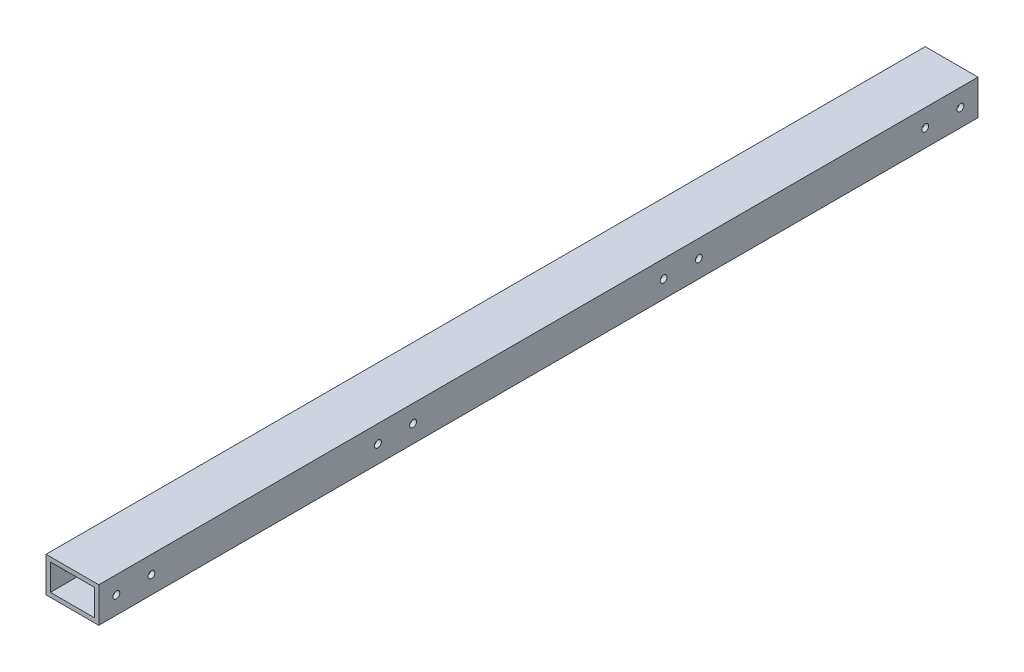
ISO-10303-21;
HEADER;
FILE_DESCRIPTION(('STEP AP214'),'2;1');
FILE_NAME('part.step','',(''),(''),'','','');
FILE_SCHEMA(('AUTOMOTIVE_DESIGN { 1 0 10303 214 1 1 1 1 }'));
ENDSEC;
DATA;
#1=APPLICATION_CONTEXT('core data for automotive mechanical design processes');
#2=APPLICATION_PROTOCOL_DEFINITION('international standard','automotive_design',2000,#1);
#3=PRODUCT_CONTEXT('',#1,'mechanical');
#4=PRODUCT('Part','Part','',(#3));
#5=PRODUCT_RELATED_PRODUCT_CATEGORY('part','',(#4));
#6=PRODUCT_DEFINITION_FORMATION('','',#4);
#7=PRODUCT_DEFINITION_CONTEXT('part definition',#1,'design');
#8=PRODUCT_DEFINITION('design','',#6,#7);
#9=PRODUCT_DEFINITION_SHAPE('','',#8);
#10=(LENGTH_UNIT() NAMED_UNIT(*) SI_UNIT(.MILLI.,.METRE.));
#11=(NAMED_UNIT(*) PLANE_ANGLE_UNIT() SI_UNIT($,.RADIAN.));
#12=(NAMED_UNIT(*) SI_UNIT($,.STERADIAN.) SOLID_ANGLE_UNIT());
#13=UNCERTAINTY_MEASURE_WITH_UNIT(LENGTH_MEASURE(1.E-05),#10,'distance_accuracy_value','');
#14=(GEOMETRIC_REPRESENTATION_CONTEXT(3) GLOBAL_UNCERTAINTY_ASSIGNED_CONTEXT((#13)) GLOBAL_UNIT_ASSIGNED_CONTEXT((#10,
#11,#12)) REPRESENTATION_CONTEXT('',''));
#15=CARTESIAN_POINT('',(0.,0.,0.));
#16=DIRECTION('',(0.,0.,1.));
#17=DIRECTION('',(1.,0.,0.));
#18=AXIS2_PLACEMENT_3D('',#15,#16,#17);
#19=CARTESIAN_POINT('',(19.05,-12.7,330.200000508));
#20=DIRECTION('',(-1.,0.,0.));
#21=DIRECTION('',(0.,-1.,0.));
#22=AXIS2_PLACEMENT_3D('',#19,#20,#21);
#23=PLANE('',#22);
#24=CARTESIAN_POINT('',(19.05,2.80157841370254E-13,128.587499999975));
#25=DIRECTION('',(1.,0.,0.));
#26=DIRECTION('',(0.,0.,-1.));
#27=AXIS2_PLACEMENT_3D('',#24,#25,#26);
#28=CIRCLE('',#27,2.4892);
#29=CARTESIAN_POINT('',(19.05,2.80157841370254E-13,126.098299999975));
#30=VERTEX_POINT('',#29);
#31=EDGE_CURVE('E423',#30,#30,#28,.T.);
#32=ORIENTED_EDGE('',*,*,#31,.F.);
#33=EDGE_LOOP('',(#32));
#34=FACE_BOUND('',#33,.T.);
#35=CARTESIAN_POINT('',(19.05,3.35668992601512E-13,103.187499999975));
#36=DIRECTION('',(1.,0.,0.));
#37=DIRECTION('',(0.,0.,-1.));
#38=AXIS2_PLACEMENT_3D('',#35,#36,#37);
#39=CIRCLE('',#38,2.4892);
#40=CARTESIAN_POINT('',(19.05,3.35668992601512E-13,100.698299999975));
#41=VERTEX_POINT('',#40);
#42=EDGE_CURVE('E220',#41,#41,#39,.T.);
#43=ORIENTED_EDGE('',*,*,#42,.F.);
#44=EDGE_LOOP('',(#43));
#45=FACE_BOUND('',#44,.T.);
#46=CARTESIAN_POINT('',(19.05,1.01448205652027E-06,-103.187500574806));
#47=DIRECTION('',(1.,0.,0.));
#48=DIRECTION('',(0.,0.,-1.));
#49=AXIS2_PLACEMENT_3D('',#46,#47,#48);
#50=CIRCLE('',#49,2.4892);
#51=CARTESIAN_POINT('',(19.05,1.01448205652027E-06,-105.676700574806));
#52=VERTEX_POINT('',#51);
#53=EDGE_CURVE('E245',#52,#52,#50,.T.);
#54=ORIENTED_EDGE('',*,*,#53,.F.);
#55=EDGE_LOOP('',(#54));
#56=FACE_BOUND('',#55,.T.);
#57=CARTESIAN_POINT('',(19.05,0.,317.500000508));
#58=DIRECTION('',(1.,0.,0.));
#59=DIRECTION('',(0.,0.,-1.));
#60=AXIS2_PLACEMENT_3D('',#57,#58,#59);
#61=CIRCLE('',#60,2.4892);
#62=CARTESIAN_POINT('',(19.05,0.,315.010800508));
#63=VERTEX_POINT('',#62);
#64=EDGE_CURVE('E255',#63,#63,#61,.T.);
#65=ORIENTED_EDGE('',*,*,#64,.F.);
#66=EDGE_LOOP('',(#65));
#67=FACE_BOUND('',#66,.T.);
#68=CARTESIAN_POINT('',(19.05,0.,292.100000508));
#69=DIRECTION('',(1.,0.,0.));
#70=DIRECTION('',(0.,0.,-1.));
#71=AXIS2_PLACEMENT_3D('',#68,#69,#70);
#72=CIRCLE('',#71,2.4892);
#73=CARTESIAN_POINT('',(19.05,0.,289.610800508));
#74=VERTEX_POINT('',#73);
#75=EDGE_CURVE('E265',#74,#74,#72,.T.);
#76=ORIENTED_EDGE('',*,*,#75,.F.);
#77=EDGE_LOOP('',(#76));
#78=FACE_BOUND('',#77,.T.);
#79=CARTESIAN_POINT('',(19.05,0.,-266.700000508));
#80=DIRECTION('',(1.,0.,0.));
#81=DIRECTION('',(0.,0.,-1.));
#82=AXIS2_PLACEMENT_3D('',#79,#80,#81);
#83=CIRCLE('',#82,2.4892);
#84=CARTESIAN_POINT('',(19.05,0.,-269.189200508));
#85=VERTEX_POINT('',#84);
#86=EDGE_CURVE('E275',#85,#85,#83,.T.);
#87=ORIENTED_EDGE('',*,*,#86,.F.);
#88=EDGE_LOOP('',(#87));
#89=FACE_BOUND('',#88,.T.);
#90=CARTESIAN_POINT('',(19.05,0.,-292.100000508));
#91=DIRECTION('',(1.,0.,0.));
#92=DIRECTION('',(0.,0.,-1.));
#93=AXIS2_PLACEMENT_3D('',#90,#91,#92);
#94=CIRCLE('',#93,2.4892);
#95=CARTESIAN_POINT('',(19.05,0.,-294.589200508));
#96=VERTEX_POINT('',#95);
#97=EDGE_CURVE('E285',#96,#96,#94,.T.);
#98=ORIENTED_EDGE('',*,*,#97,.F.);
#99=EDGE_LOOP('',(#98));
#100=FACE_BOUND('',#99,.T.);
#101=DIRECTION('',(0.,-1.,0.));
#102=VECTOR('',#101,1.);
#103=CARTESIAN_POINT('',(19.05,-12.7,-304.800000508));
#104=LINE('',#103,#102);
#105=CARTESIAN_POINT('',(19.05,12.7,-304.800000508));
#106=VERTEX_POINT('',#105);
#107=CARTESIAN_POINT('',(19.05,-12.7,-304.800000508));
#108=VERTEX_POINT('',#107);
#109=EDGE_CURVE('E302',#106,#108,#104,.T.);
#110=ORIENTED_EDGE('',*,*,#109,.F.);
#111=DIRECTION('',(0.,0.,-1.));
#112=VECTOR('',#111,1.);
#113=CARTESIAN_POINT('',(19.05,12.7,330.200000508));
#114=LINE('',#113,#112);
#115=CARTESIAN_POINT('',(19.05,12.7,330.200000508));
#116=VERTEX_POINT('',#115);
#117=EDGE_CURVE('E170',#116,#106,#114,.T.);
#118=ORIENTED_EDGE('',*,*,#117,.F.);
#119=DIRECTION('',(0.,1.,0.));
#120=VECTOR('',#119,1.);
#121=CARTESIAN_POINT('',(19.05,-12.7,330.200000508));
#122=LINE('',#121,#120);
#123=CARTESIAN_POINT('',(19.05,-12.7,330.200000508));
#124=VERTEX_POINT('',#123);
#125=EDGE_CURVE('E161',#124,#116,#122,.T.);
#126=ORIENTED_EDGE('',*,*,#125,.F.);
#127=DIRECTION('',(0.,0.,-1.));
#128=VECTOR('',#127,1.);
#129=CARTESIAN_POINT('',(19.05,-12.7,330.200000508));
#130=LINE('',#129,#128);
#131=EDGE_CURVE('E173',#124,#108,#130,.T.);
#132=ORIENTED_EDGE('',*,*,#131,.T.);
#133=EDGE_LOOP('',(#110,#118,#126,#132));
#134=FACE_BOUND('',#133,.T.);
#135=CARTESIAN_POINT('',(19.05,1.01448200100912E-06,-77.7875005748059));
#136=DIRECTION('',(1.,0.,0.));
#137=DIRECTION('',(0.,0.,-1.));
#138=AXIS2_PLACEMENT_3D('',#135,#136,#137);
#139=CIRCLE('',#138,2.4892);
#140=CARTESIAN_POINT('',(19.05,1.01448200100912E-06,-80.2767005748059));
#141=VERTEX_POINT('',#140);
#142=EDGE_CURVE('E217',#141,#141,#139,.T.);
#143=ORIENTED_EDGE('',*,*,#142,.F.);
#144=EDGE_LOOP('',(#143));
#145=FACE_BOUND('',#144,.T.);
#146=ADVANCED_FACE('F44',(#34,#45,#56,#67,#78,#89,#100,#134,#145),#23,.F.);
#147=CARTESIAN_POINT('',(-19.05,12.7,330.200000508));
#148=DIRECTION('',(1.,0.,0.));
#149=DIRECTION('',(0.,0.,-1.));
#150=AXIS2_PLACEMENT_3D('',#147,#148,#149);
#151=PLANE('',#150);
#152=CARTESIAN_POINT('',(-19.05,2.80157841370254E-13,128.587499999975));
#153=DIRECTION('',(1.,0.,0.));
#154=DIRECTION('',(0.,0.,-1.));
#155=AXIS2_PLACEMENT_3D('',#152,#153,#154);
#156=CIRCLE('',#155,2.48919999999999);
#157=CARTESIAN_POINT('',(-19.05,2.80157841370254E-13,126.098299999975));
#158=VERTEX_POINT('',#157);
#159=EDGE_CURVE('E425',#158,#158,#156,.T.);
#160=ORIENTED_EDGE('',*,*,#159,.T.);
#161=EDGE_LOOP('',(#160));
#162=FACE_BOUND('',#161,.T.);
#163=CARTESIAN_POINT('',(-19.05,3.35668992601512E-13,103.187499999975));
#164=DIRECTION('',(1.,0.,0.));
#165=DIRECTION('',(0.,0.,-1.));
#166=AXIS2_PLACEMENT_3D('',#163,#164,#165);
#167=CIRCLE('',#166,2.48919999999999);
#168=CARTESIAN_POINT('',(-19.05,3.35668992601512E-13,100.698299999975));
#169=VERTEX_POINT('',#168);
#170=EDGE_CURVE('E211',#169,#169,#167,.T.);
#171=ORIENTED_EDGE('',*,*,#170,.T.);
#172=EDGE_LOOP('',(#171));
#173=FACE_BOUND('',#172,.T.);
#174=CARTESIAN_POINT('',(-19.05,1.01448200100912E-06,-77.7875005748059));
#175=DIRECTION('',(1.,0.,0.));
#176=DIRECTION('',(0.,0.,-1.));
#177=AXIS2_PLACEMENT_3D('',#174,#175,#176);
#178=CIRCLE('',#177,2.48919999999999);
#179=CARTESIAN_POINT('',(-19.05,1.01448200100912E-06,-80.2767005748059));
#180=VERTEX_POINT('',#179);
#181=EDGE_CURVE('E233',#180,#180,#178,.T.);
#182=ORIENTED_EDGE('',*,*,#181,.T.);
#183=EDGE_LOOP('',(#182));
#184=FACE_BOUND('',#183,.T.);
#185=CARTESIAN_POINT('',(-19.05,1.01448205652027E-06,-103.187500574806));
#186=DIRECTION('',(1.,0.,0.));
#187=DIRECTION('',(0.,0.,-1.));
#188=AXIS2_PLACEMENT_3D('',#185,#186,#187);
#189=CIRCLE('',#188,2.48919999999999);
#190=CARTESIAN_POINT('',(-19.05,1.01448205652027E-06,-105.676700574806));
#191=VERTEX_POINT('',#190);
#192=EDGE_CURVE('E206',#191,#191,#189,.T.);
#193=ORIENTED_EDGE('',*,*,#192,.T.);
#194=EDGE_LOOP('',(#193));
#195=FACE_BOUND('',#194,.T.);
#196=CARTESIAN_POINT('',(-19.05,0.,317.500000508));
#197=DIRECTION('',(1.,0.,0.));
#198=DIRECTION('',(0.,0.,-1.));
#199=AXIS2_PLACEMENT_3D('',#196,#197,#198);
#200=CIRCLE('',#199,2.48919999999999);
#201=CARTESIAN_POINT('',(-19.05,0.,315.010800508));
#202=VERTEX_POINT('',#201);
#203=EDGE_CURVE('E201',#202,#202,#200,.T.);
#204=ORIENTED_EDGE('',*,*,#203,.T.);
#205=EDGE_LOOP('',(#204));
#206=FACE_BOUND('',#205,.T.);
#207=CARTESIAN_POINT('',(-19.05,0.,292.100000508));
#208=DIRECTION('',(1.,0.,0.));
#209=DIRECTION('',(0.,0.,-1.));
#210=AXIS2_PLACEMENT_3D('',#207,#208,#209);
#211=CIRCLE('',#210,2.48919999999999);
#212=CARTESIAN_POINT('',(-19.05,0.,289.610800508));
#213=VERTEX_POINT('',#212);
#214=EDGE_CURVE('E195',#213,#213,#211,.T.);
#215=ORIENTED_EDGE('',*,*,#214,.T.);
#216=EDGE_LOOP('',(#215));
#217=FACE_BOUND('',#216,.T.);
#218=CARTESIAN_POINT('',(-19.05,0.,-266.700000508));
#219=DIRECTION('',(1.,0.,0.));
#220=DIRECTION('',(0.,0.,-1.));
#221=AXIS2_PLACEMENT_3D('',#218,#219,#220);
#222=CIRCLE('',#221,2.48919999999999);
#223=CARTESIAN_POINT('',(-19.05,0.,-269.189200508));
#224=VERTEX_POINT('',#223);
#225=EDGE_CURVE('E189',#224,#224,#222,.T.);
#226=ORIENTED_EDGE('',*,*,#225,.T.);
#227=EDGE_LOOP('',(#226));
#228=FACE_BOUND('',#227,.T.);
#229=CARTESIAN_POINT('',(-19.05,0.,-292.100000508));
#230=DIRECTION('',(1.,0.,0.));
#231=DIRECTION('',(0.,0.,-1.));
#232=AXIS2_PLACEMENT_3D('',#229,#230,#231);
#233=CIRCLE('',#232,2.48919999999999);
#234=CARTESIAN_POINT('',(-19.05,0.,-294.589200508));
#235=VERTEX_POINT('',#234);
#236=EDGE_CURVE('E183',#235,#235,#233,.T.);
#237=ORIENTED_EDGE('',*,*,#236,.T.);
#238=EDGE_LOOP('',(#237));
#239=FACE_BOUND('',#238,.T.);
#240=DIRECTION('',(0.,1.,0.));
#241=VECTOR('',#240,1.);
#242=CARTESIAN_POINT('',(-19.05,12.7,-304.800000508));
#243=LINE('',#242,#241);
#244=CARTESIAN_POINT('',(-19.05,-12.7,-304.800000508));
#245=VERTEX_POINT('',#244);
#246=CARTESIAN_POINT('',(-19.05,12.7,-304.800000508));
#247=VERTEX_POINT('',#246);
#248=EDGE_CURVE('E62',#245,#247,#243,.T.);
#249=ORIENTED_EDGE('',*,*,#248,.F.);
#250=DIRECTION('',(0.,0.,-1.));
#251=VECTOR('',#250,1.);
#252=CARTESIAN_POINT('',(-19.05,-12.7,330.200000508));
#253=LINE('',#252,#251);
#254=CARTESIAN_POINT('',(-19.05,-12.7,330.200000508));
#255=VERTEX_POINT('',#254);
#256=EDGE_CURVE('E54',#255,#245,#253,.T.);
#257=ORIENTED_EDGE('',*,*,#256,.F.);
#258=DIRECTION('',(0.,-1.,0.));
#259=VECTOR('',#258,1.);
#260=CARTESIAN_POINT('',(-19.05,12.7,330.200000508));
#261=LINE('',#260,#259);
#262=CARTESIAN_POINT('',(-19.05,12.7,330.200000508));
#263=VERTEX_POINT('',#262);
#264=EDGE_CURVE('E154',#263,#255,#261,.T.);
#265=ORIENTED_EDGE('',*,*,#264,.F.);
#266=DIRECTION('',(0.,0.,-1.));
#267=VECTOR('',#266,1.);
#268=CARTESIAN_POINT('',(-19.05,12.7,330.200000508));
#269=LINE('',#268,#267);
#270=EDGE_CURVE('E167',#263,#247,#269,.T.);
#271=ORIENTED_EDGE('',*,*,#270,.T.);
#272=EDGE_LOOP('',(#249,#257,#265,#271));
#273=FACE_BOUND('',#272,.T.);
#274=ADVANCED_FACE('F46',(#162,#173,#184,#195,#206,#217,#228,#239,#273),#151,.F.);
#275=CARTESIAN_POINT('',(-19.05,-12.7,330.200000508));
#276=DIRECTION('',(0.,1.,0.));
#277=DIRECTION('',(0.,0.,1.));
#278=AXIS2_PLACEMENT_3D('',#275,#276,#277);
#279=PLANE('',#278);
#280=DIRECTION('',(-1.,0.,0.));
#281=VECTOR('',#280,1.);
#282=CARTESIAN_POINT('',(-19.05,-12.7,-304.800000508));
#283=LINE('',#282,#281);
#284=EDGE_CURVE('E69',#108,#245,#283,.T.);
#285=ORIENTED_EDGE('',*,*,#284,.F.);
#286=ORIENTED_EDGE('',*,*,#131,.F.);
#287=DIRECTION('',(1.,0.,0.));
#288=VECTOR('',#287,1.);
#289=CARTESIAN_POINT('',(-19.05,-12.7,330.200000508));
#290=LINE('',#289,#288);
#291=EDGE_CURVE('E158',#255,#124,#290,.T.);
#292=ORIENTED_EDGE('',*,*,#291,.F.);
#293=ORIENTED_EDGE('',*,*,#256,.T.);
#294=EDGE_LOOP('',(#285,#286,#292,#293));
#295=FACE_BOUND('',#294,.T.);
#296=ADVANCED_FACE('F343',(#295),#279,.F.);
#297=CARTESIAN_POINT('',(19.05,12.7,330.200000508));
#298=DIRECTION('',(0.,-1.,0.));
#299=DIRECTION('',(0.,0.,-1.));
#300=AXIS2_PLACEMENT_3D('',#297,#298,#299);
#301=PLANE('',#300);
#302=DIRECTION('',(1.,0.,0.));
#303=VECTOR('',#302,1.);
#304=CARTESIAN_POINT('',(19.05,12.7,-304.800000508));
#305=LINE('',#304,#303);
#306=EDGE_CURVE('E132',#247,#106,#305,.T.);
#307=ORIENTED_EDGE('',*,*,#306,.F.);
#308=ORIENTED_EDGE('',*,*,#270,.F.);
#309=DIRECTION('',(-1.,0.,0.));
#310=VECTOR('',#309,1.);
#311=CARTESIAN_POINT('',(19.05,12.7,330.200000508));
#312=LINE('',#311,#310);
#313=EDGE_CURVE('E164',#116,#263,#312,.T.);
#314=ORIENTED_EDGE('',*,*,#313,.F.);
#315=ORIENTED_EDGE('',*,*,#117,.T.);
#316=EDGE_LOOP('',(#307,#308,#314,#315));
#317=FACE_BOUND('',#316,.T.);
#318=ADVANCED_FACE('F334',(#317),#301,.F.);
#319=CARTESIAN_POINT('',(-15.875,9.525,330.200000508));
#320=DIRECTION('',(1.,0.,0.));
#321=DIRECTION('',(0.,1.,0.));
#322=AXIS2_PLACEMENT_3D('',#319,#320,#321);
#323=PLANE('',#322);
#324=CARTESIAN_POINT('',(-15.875,2.80157841370254E-13,128.587499999975));
#325=DIRECTION('',(1.,0.,0.));
#326=DIRECTION('',(0.,1.,0.));
#327=AXIS2_PLACEMENT_3D('',#324,#325,#326);
#328=CIRCLE('',#327,2.48919999999999);
#329=CARTESIAN_POINT('',(-15.875,2.48920000000027,128.587499999975));
#330=VERTEX_POINT('',#329);
#331=EDGE_CURVE('E226',#330,#330,#328,.T.);
#332=ORIENTED_EDGE('',*,*,#331,.F.);
#333=EDGE_LOOP('',(#332));
#334=FACE_BOUND('',#333,.T.);
#335=CARTESIAN_POINT('',(-15.875,3.35668992601512E-13,103.187499999975));
#336=DIRECTION('',(1.,0.,0.));
#337=DIRECTION('',(0.,1.,0.));
#338=AXIS2_PLACEMENT_3D('',#335,#336,#337);
#339=CIRCLE('',#338,2.48919999999999);
#340=CARTESIAN_POINT('',(-15.875,2.48920000000033,103.187499999975));
#341=VERTEX_POINT('',#340);
#342=EDGE_CURVE('E210',#341,#341,#339,.T.);
#343=ORIENTED_EDGE('',*,*,#342,.F.);
#344=EDGE_LOOP('',(#343));
#345=FACE_BOUND('',#344,.T.);
#346=CARTESIAN_POINT('',(-15.875,1.01448200100912E-06,-77.7875005748059));
#347=DIRECTION('',(1.,0.,0.));
#348=DIRECTION('',(0.,1.,0.));
#349=AXIS2_PLACEMENT_3D('',#346,#347,#348);
#350=CIRCLE('',#349,2.48919999999999);
#351=CARTESIAN_POINT('',(-15.875,2.48920101448199,-77.7875005748059));
#352=VERTEX_POINT('',#351);
#353=EDGE_CURVE('E241',#352,#352,#350,.T.);
#354=ORIENTED_EDGE('',*,*,#353,.F.);
#355=EDGE_LOOP('',(#354));
#356=FACE_BOUND('',#355,.T.);
#357=CARTESIAN_POINT('',(-15.875,1.01448205652027E-06,-103.187500574806));
#358=DIRECTION('',(1.,0.,0.));
#359=DIRECTION('',(0.,1.,0.));
#360=AXIS2_PLACEMENT_3D('',#357,#358,#359);
#361=CIRCLE('',#360,2.48919999999999);
#362=CARTESIAN_POINT('',(-15.875,2.48920101448205,-103.187500574806));
#363=VERTEX_POINT('',#362);
#364=EDGE_CURVE('E205',#363,#363,#361,.T.);
#365=ORIENTED_EDGE('',*,*,#364,.F.);
#366=EDGE_LOOP('',(#365));
#367=FACE_BOUND('',#366,.T.);
#368=CARTESIAN_POINT('',(-15.875,0.,317.500000508));
#369=DIRECTION('',(1.,0.,0.));
#370=DIRECTION('',(0.,1.,0.));
#371=AXIS2_PLACEMENT_3D('',#368,#369,#370);
#372=CIRCLE('',#371,2.48919999999999);
#373=CARTESIAN_POINT('',(-15.875,2.4892,317.500000508));
#374=VERTEX_POINT('',#373);
#375=EDGE_CURVE('E200',#374,#374,#372,.T.);
#376=ORIENTED_EDGE('',*,*,#375,.F.);
#377=EDGE_LOOP('',(#376));
#378=FACE_BOUND('',#377,.T.);
#379=CARTESIAN_POINT('',(-15.875,0.,292.100000508));
#380=DIRECTION('',(1.,0.,0.));
#381=DIRECTION('',(0.,1.,0.));
#382=AXIS2_PLACEMENT_3D('',#379,#380,#381);
#383=CIRCLE('',#382,2.48919999999999);
#384=CARTESIAN_POINT('',(-15.875,2.4892,292.100000508));
#385=VERTEX_POINT('',#384);
#386=EDGE_CURVE('E194',#385,#385,#383,.T.);
#387=ORIENTED_EDGE('',*,*,#386,.F.);
#388=EDGE_LOOP('',(#387));
#389=FACE_BOUND('',#388,.T.);
#390=CARTESIAN_POINT('',(-15.875,0.,-266.700000508));
#391=DIRECTION('',(1.,0.,0.));
#392=DIRECTION('',(0.,1.,0.));
#393=AXIS2_PLACEMENT_3D('',#390,#391,#392);
#394=CIRCLE('',#393,2.48919999999999);
#395=CARTESIAN_POINT('',(-15.875,2.48919999999999,-266.700000508));
#396=VERTEX_POINT('',#395);
#397=EDGE_CURVE('E188',#396,#396,#394,.T.);
#398=ORIENTED_EDGE('',*,*,#397,.F.);
#399=EDGE_LOOP('',(#398));
#400=FACE_BOUND('',#399,.T.);
#401=CARTESIAN_POINT('',(-15.875,0.,-292.100000508));
#402=DIRECTION('',(1.,0.,0.));
#403=DIRECTION('',(0.,1.,0.));
#404=AXIS2_PLACEMENT_3D('',#401,#402,#403);
#405=CIRCLE('',#404,2.48919999999999);
#406=CARTESIAN_POINT('',(-15.875,2.48919999999999,-292.100000508));
#407=VERTEX_POINT('',#406);
#408=EDGE_CURVE('E182',#407,#407,#405,.T.);
#409=ORIENTED_EDGE('',*,*,#408,.F.);
#410=EDGE_LOOP('',(#409));
#411=FACE_BOUND('',#410,.T.);
#412=DIRECTION('',(0.,0.,-1.));
#413=VECTOR('',#412,1.);
#414=CARTESIAN_POINT('',(-15.875,-9.525,330.200000508));
#415=LINE('',#414,#413);
#416=CARTESIAN_POINT('',(-15.875,-9.525,330.200000508));
#417=VERTEX_POINT('',#416);
#418=CARTESIAN_POINT('',(-15.875,-9.525,-304.800000508));
#419=VERTEX_POINT('',#418);
#420=EDGE_CURVE('E130',#417,#419,#415,.T.);
#421=ORIENTED_EDGE('',*,*,#420,.T.);
#422=DIRECTION('',(0.,1.,0.));
#423=VECTOR('',#422,1.);
#424=CARTESIAN_POINT('',(-15.875,9.525,-304.800000508));
#425=LINE('',#424,#423);
#426=CARTESIAN_POINT('',(-15.875,9.525,-304.800000508));
#427=VERTEX_POINT('',#426);
#428=EDGE_CURVE('E116',#419,#427,#425,.T.);
#429=ORIENTED_EDGE('',*,*,#428,.T.);
#430=DIRECTION('',(0.,0.,-1.));
#431=VECTOR('',#430,1.);
#432=CARTESIAN_POINT('',(-15.875,9.525,330.200000508));
#433=LINE('',#432,#431);
#434=CARTESIAN_POINT('',(-15.875,9.525,330.200000508));
#435=VERTEX_POINT('',#434);
#436=EDGE_CURVE('E127',#435,#427,#433,.T.);
#437=ORIENTED_EDGE('',*,*,#436,.F.);
#438=DIRECTION('',(0.,-1.,0.));
#439=VECTOR('',#438,1.);
#440=CARTESIAN_POINT('',(-15.875,9.525,330.200000508));
#441=LINE('',#440,#439);
#442=EDGE_CURVE('E310',#435,#417,#441,.T.);
#443=ORIENTED_EDGE('',*,*,#442,.T.);
#444=EDGE_LOOP('',(#421,#429,#437,#443));
#445=FACE_BOUND('',#444,.T.);
#446=ADVANCED_FACE('F126',(#334,#345,#356,#367,#378,#389,#400,#411,#445),#323,.T.);
#447=CARTESIAN_POINT('',(-15.875,-9.525,330.200000508));
#448=DIRECTION('',(0.,1.,0.));
#449=DIRECTION('',(0.,0.,1.));
#450=AXIS2_PLACEMENT_3D('',#447,#448,#449);
#451=PLANE('',#450);
#452=DIRECTION('',(0.,0.,-1.));
#453=VECTOR('',#452,1.);
#454=CARTESIAN_POINT('',(15.875,-9.525,330.200000508));
#455=LINE('',#454,#453);
#456=CARTESIAN_POINT('',(15.875,-9.525,330.200000508));
#457=VERTEX_POINT('',#456);
#458=CARTESIAN_POINT('',(15.875,-9.525,-304.800000508));
#459=VERTEX_POINT('',#458);
#460=EDGE_CURVE('E143',#457,#459,#455,.T.);
#461=ORIENTED_EDGE('',*,*,#460,.T.);
#462=DIRECTION('',(-1.,0.,0.));
#463=VECTOR('',#462,1.);
#464=CARTESIAN_POINT('',(-15.875,-9.525,-304.800000508));
#465=LINE('',#464,#463);
#466=EDGE_CURVE('E133',#459,#419,#465,.T.);
#467=ORIENTED_EDGE('',*,*,#466,.T.);
#468=ORIENTED_EDGE('',*,*,#420,.F.);
#469=DIRECTION('',(1.,0.,0.));
#470=VECTOR('',#469,1.);
#471=CARTESIAN_POINT('',(-15.875,-9.525,330.200000508));
#472=LINE('',#471,#470);
#473=EDGE_CURVE('E313',#417,#457,#472,.T.);
#474=ORIENTED_EDGE('',*,*,#473,.T.);
#475=EDGE_LOOP('',(#461,#467,#468,#474));
#476=FACE_BOUND('',#475,.T.);
#477=ADVANCED_FACE('F325',(#476),#451,.T.);
#478=CARTESIAN_POINT('',(15.875,-9.525,330.200000508));
#479=DIRECTION('',(-1.,0.,0.));
#480=DIRECTION('',(0.,-1.,0.));
#481=AXIS2_PLACEMENT_3D('',#478,#479,#480);
#482=PLANE('',#481);
#483=CARTESIAN_POINT('',(15.875,2.80157841370254E-13,128.587499999975));
#484=DIRECTION('',(-1.,0.,0.));
#485=DIRECTION('',(0.,-1.,0.));
#486=AXIS2_PLACEMENT_3D('',#483,#484,#485);
#487=CIRCLE('',#486,2.48919999999999);
#488=CARTESIAN_POINT('',(15.875,-2.48919999999971,128.587499999975));
#489=VERTEX_POINT('',#488);
#490=EDGE_CURVE('E48',#489,#489,#487,.T.);
#491=ORIENTED_EDGE('',*,*,#490,.F.);
#492=EDGE_LOOP('',(#491));
#493=FACE_BOUND('',#492,.T.);
#494=CARTESIAN_POINT('',(15.875,3.35668992601512E-13,103.187499999975));
#495=DIRECTION('',(-1.,0.,0.));
#496=DIRECTION('',(0.,-1.,0.));
#497=AXIS2_PLACEMENT_3D('',#494,#495,#496);
#498=CIRCLE('',#497,2.48919999999999);
#499=CARTESIAN_POINT('',(15.875,-2.48919999999966,103.187499999975));
#500=VERTEX_POINT('',#499);
#501=EDGE_CURVE('E207',#500,#500,#498,.T.);
#502=ORIENTED_EDGE('',*,*,#501,.F.);
#503=EDGE_LOOP('',(#502));
#504=FACE_BOUND('',#503,.T.);
#505=CARTESIAN_POINT('',(15.875,1.01448200100912E-06,-77.7875005748059));
#506=DIRECTION('',(-1.,0.,0.));
#507=DIRECTION('',(0.,-1.,0.));
#508=AXIS2_PLACEMENT_3D('',#505,#506,#507);
#509=CIRCLE('',#508,2.48919999999999);
#510=CARTESIAN_POINT('',(15.875,-2.48919898551799,-77.7875005748059));
#511=VERTEX_POINT('',#510);
#512=EDGE_CURVE('E237',#511,#511,#509,.T.);
#513=ORIENTED_EDGE('',*,*,#512,.F.);
#514=EDGE_LOOP('',(#513));
#515=FACE_BOUND('',#514,.T.);
#516=CARTESIAN_POINT('',(15.875,1.01448205652027E-06,-103.187500574806));
#517=DIRECTION('',(-1.,0.,0.));
#518=DIRECTION('',(0.,-1.,0.));
#519=AXIS2_PLACEMENT_3D('',#516,#517,#518);
#520=CIRCLE('',#519,2.48919999999999);
#521=CARTESIAN_POINT('',(15.875,-2.48919898551794,-103.187500574806));
#522=VERTEX_POINT('',#521);
#523=EDGE_CURVE('E202',#522,#522,#520,.T.);
#524=ORIENTED_EDGE('',*,*,#523,.F.);
#525=EDGE_LOOP('',(#524));
#526=FACE_BOUND('',#525,.T.);
#527=CARTESIAN_POINT('',(15.875,0.,317.500000508));
#528=DIRECTION('',(-1.,0.,0.));
#529=DIRECTION('',(0.,-1.,0.));
#530=AXIS2_PLACEMENT_3D('',#527,#528,#529);
#531=CIRCLE('',#530,2.48919999999999);
#532=CARTESIAN_POINT('',(15.875,-2.48919999999999,317.500000508));
#533=VERTEX_POINT('',#532);
#534=EDGE_CURVE('E196',#533,#533,#531,.T.);
#535=ORIENTED_EDGE('',*,*,#534,.F.);
#536=EDGE_LOOP('',(#535));
#537=FACE_BOUND('',#536,.T.);
#538=CARTESIAN_POINT('',(15.875,0.,292.100000508));
#539=DIRECTION('',(-1.,0.,0.));
#540=DIRECTION('',(0.,-1.,0.));
#541=AXIS2_PLACEMENT_3D('',#538,#539,#540);
#542=CIRCLE('',#541,2.48919999999999);
#543=CARTESIAN_POINT('',(15.875,-2.48919999999999,292.100000508));
#544=VERTEX_POINT('',#543);
#545=EDGE_CURVE('E190',#544,#544,#542,.T.);
#546=ORIENTED_EDGE('',*,*,#545,.F.);
#547=EDGE_LOOP('',(#546));
#548=FACE_BOUND('',#547,.T.);
#549=CARTESIAN_POINT('',(15.875,0.,-266.700000508));
#550=DIRECTION('',(-1.,0.,0.));
#551=DIRECTION('',(0.,-1.,0.));
#552=AXIS2_PLACEMENT_3D('',#549,#550,#551);
#553=CIRCLE('',#552,2.48919999999999);
#554=CARTESIAN_POINT('',(15.875,-2.48919999999999,-266.700000508));
#555=VERTEX_POINT('',#554);
#556=EDGE_CURVE('E184',#555,#555,#553,.T.);
#557=ORIENTED_EDGE('',*,*,#556,.F.);
#558=EDGE_LOOP('',(#557));
#559=FACE_BOUND('',#558,.T.);
#560=CARTESIAN_POINT('',(15.875,0.,-292.100000508));
#561=DIRECTION('',(-1.,0.,0.));
#562=DIRECTION('',(0.,-1.,0.));
#563=AXIS2_PLACEMENT_3D('',#560,#561,#562);
#564=CIRCLE('',#563,2.48919999999999);
#565=CARTESIAN_POINT('',(15.875,-2.48919999999999,-292.100000508));
#566=VERTEX_POINT('',#565);
#567=EDGE_CURVE('E178',#566,#566,#564,.T.);
#568=ORIENTED_EDGE('',*,*,#567,.F.);
#569=EDGE_LOOP('',(#568));
#570=FACE_BOUND('',#569,.T.);
#571=DIRECTION('',(0.,0.,-1.));
#572=VECTOR('',#571,1.);
#573=CARTESIAN_POINT('',(15.875,9.525,330.200000508));
#574=LINE('',#573,#572);
#575=CARTESIAN_POINT('',(15.875,9.525,330.200000508));
#576=VERTEX_POINT('',#575);
#577=CARTESIAN_POINT('',(15.875,9.525,-304.800000508));
#578=VERTEX_POINT('',#577);
#579=EDGE_CURVE('E139',#576,#578,#574,.T.);
#580=ORIENTED_EDGE('',*,*,#579,.T.);
#581=DIRECTION('',(0.,-1.,0.));
#582=VECTOR('',#581,1.);
#583=CARTESIAN_POINT('',(15.875,-9.525,-304.800000508));
#584=LINE('',#583,#582);
#585=EDGE_CURVE('E119',#578,#459,#584,.T.);
#586=ORIENTED_EDGE('',*,*,#585,.T.);
#587=ORIENTED_EDGE('',*,*,#460,.F.);
#588=DIRECTION('',(0.,1.,0.));
#589=VECTOR('',#588,1.);
#590=CARTESIAN_POINT('',(15.875,-9.525,330.200000508));
#591=LINE('',#590,#589);
#592=EDGE_CURVE('E145',#457,#576,#591,.T.);
#593=ORIENTED_EDGE('',*,*,#592,.T.);
#594=EDGE_LOOP('',(#580,#586,#587,#593));
#595=FACE_BOUND('',#594,.T.);
#596=ADVANCED_FACE('F320',(#493,#504,#515,#526,#537,#548,#559,#570,#595),#482,.T.);
#597=CARTESIAN_POINT('',(15.875,9.525,330.200000508));
#598=DIRECTION('',(0.,-1.,0.));
#599=DIRECTION('',(0.,0.,-1.));
#600=AXIS2_PLACEMENT_3D('',#597,#598,#599);
#601=PLANE('',#600);
#602=ORIENTED_EDGE('',*,*,#436,.T.);
#603=DIRECTION('',(1.,0.,0.));
#604=VECTOR('',#603,1.);
#605=CARTESIAN_POINT('',(15.875,9.525,-304.800000508));
#606=LINE('',#605,#604);
#607=EDGE_CURVE('E12',#427,#578,#606,.T.);
#608=ORIENTED_EDGE('',*,*,#607,.T.);
#609=ORIENTED_EDGE('',*,*,#579,.F.);
#610=DIRECTION('',(-1.,0.,0.));
#611=VECTOR('',#610,1.);
#612=CARTESIAN_POINT('',(15.875,9.525,330.200000508));
#613=LINE('',#612,#611);
#614=EDGE_CURVE('E137',#576,#435,#613,.T.);
#615=ORIENTED_EDGE('',*,*,#614,.T.);
#616=EDGE_LOOP('',(#602,#608,#609,#615));
#617=FACE_BOUND('',#616,.T.);
#618=ADVANCED_FACE('F135',(#617),#601,.T.);
#619=CARTESIAN_POINT('',(0.,0.,330.200000508));
#620=DIRECTION('',(0.,0.,1.));
#621=DIRECTION('',(1.,0.,0.));
#622=AXIS2_PLACEMENT_3D('',#619,#620,#621);
#623=PLANE('',#622);
#624=ORIENTED_EDGE('',*,*,#264,.T.);
#625=ORIENTED_EDGE('',*,*,#291,.T.);
#626=ORIENTED_EDGE('',*,*,#125,.T.);
#627=ORIENTED_EDGE('',*,*,#313,.T.);
#628=EDGE_LOOP('',(#624,#625,#626,#627));
#629=FACE_BOUND('',#628,.T.);
#630=ORIENTED_EDGE('',*,*,#473,.F.);
#631=ORIENTED_EDGE('',*,*,#442,.F.);
#632=ORIENTED_EDGE('',*,*,#614,.F.);
#633=ORIENTED_EDGE('',*,*,#592,.F.);
#634=EDGE_LOOP('',(#630,#631,#632,#633));
#635=FACE_BOUND('',#634,.T.);
#636=ADVANCED_FACE('F323',(#629,#635),#623,.T.);
#637=CARTESIAN_POINT('',(0.,0.,-304.800000508));
#638=DIRECTION('',(0.,0.,-1.));
#639=DIRECTION('',(-1.,0.,0.));
#640=AXIS2_PLACEMENT_3D('',#637,#638,#639);
#641=PLANE('',#640);
#642=ORIENTED_EDGE('',*,*,#428,.F.);
#643=ORIENTED_EDGE('',*,*,#466,.F.);
#644=ORIENTED_EDGE('',*,*,#585,.F.);
#645=ORIENTED_EDGE('',*,*,#607,.F.);
#646=EDGE_LOOP('',(#642,#643,#644,#645));
#647=FACE_BOUND('',#646,.T.);
#648=ORIENTED_EDGE('',*,*,#284,.T.);
#649=ORIENTED_EDGE('',*,*,#248,.T.);
#650=ORIENTED_EDGE('',*,*,#306,.T.);
#651=ORIENTED_EDGE('',*,*,#109,.T.);
#652=EDGE_LOOP('',(#648,#649,#650,#651));
#653=FACE_BOUND('',#652,.T.);
#654=ADVANCED_FACE('F114',(#647,#653),#641,.T.);
#655=CARTESIAN_POINT('',(19.05,0.,-292.100000508));
#656=DIRECTION('',(1.,0.,0.));
#657=DIRECTION('',(0.,0.,-1.));
#658=AXIS2_PLACEMENT_3D('',#655,#656,#657);
#659=CYLINDRICAL_SURFACE('',#658,2.48919999999999);
#660=ORIENTED_EDGE('',*,*,#567,.T.);
#661=EDGE_LOOP('',(#660));
#662=FACE_BOUND('',#661,.T.);
#663=ORIENTED_EDGE('',*,*,#97,.T.);
#664=EDGE_LOOP('',(#663));
#665=FACE_BOUND('',#664,.T.);
#666=ADVANCED_FACE('F370',(#662,#665),#659,.F.);
#667=ORIENTED_EDGE('',*,*,#408,.T.);
#668=EDGE_LOOP('',(#667));
#669=FACE_BOUND('',#668,.T.);
#670=ORIENTED_EDGE('',*,*,#236,.F.);
#671=EDGE_LOOP('',(#670));
#672=FACE_BOUND('',#671,.T.);
#673=ADVANCED_FACE('F378',(#669,#672),#659,.F.);
#674=CARTESIAN_POINT('',(19.05,0.,-266.700000508));
#675=DIRECTION('',(1.,0.,0.));
#676=DIRECTION('',(0.,0.,-1.));
#677=AXIS2_PLACEMENT_3D('',#674,#675,#676);
#678=CYLINDRICAL_SURFACE('',#677,2.48919999999999);
#679=ORIENTED_EDGE('',*,*,#556,.T.);
#680=EDGE_LOOP('',(#679));
#681=FACE_BOUND('',#680,.T.);
#682=ORIENTED_EDGE('',*,*,#86,.T.);
#683=EDGE_LOOP('',(#682));
#684=FACE_BOUND('',#683,.T.);
#685=ADVANCED_FACE('F380',(#681,#684),#678,.F.);
#686=ORIENTED_EDGE('',*,*,#397,.T.);
#687=EDGE_LOOP('',(#686));
#688=FACE_BOUND('',#687,.T.);
#689=ORIENTED_EDGE('',*,*,#225,.F.);
#690=EDGE_LOOP('',(#689));
#691=FACE_BOUND('',#690,.T.);
#692=ADVANCED_FACE('F383',(#688,#691),#678,.F.);
#693=CARTESIAN_POINT('',(19.05,0.,292.100000508));
#694=DIRECTION('',(1.,0.,0.));
#695=DIRECTION('',(0.,0.,-1.));
#696=AXIS2_PLACEMENT_3D('',#693,#694,#695);
#697=CYLINDRICAL_SURFACE('',#696,2.48919999999999);
#698=ORIENTED_EDGE('',*,*,#545,.T.);
#699=EDGE_LOOP('',(#698));
#700=FACE_BOUND('',#699,.T.);
#701=ORIENTED_EDGE('',*,*,#75,.T.);
#702=EDGE_LOOP('',(#701));
#703=FACE_BOUND('',#702,.T.);
#704=ADVANCED_FACE('F385',(#700,#703),#697,.F.);
#705=ORIENTED_EDGE('',*,*,#386,.T.);
#706=EDGE_LOOP('',(#705));
#707=FACE_BOUND('',#706,.T.);
#708=ORIENTED_EDGE('',*,*,#214,.F.);
#709=EDGE_LOOP('',(#708));
#710=FACE_BOUND('',#709,.T.);
#711=ADVANCED_FACE('F388',(#707,#710),#697,.F.);
#712=CARTESIAN_POINT('',(19.05,0.,317.500000508));
#713=DIRECTION('',(1.,0.,0.));
#714=DIRECTION('',(0.,0.,-1.));
#715=AXIS2_PLACEMENT_3D('',#712,#713,#714);
#716=CYLINDRICAL_SURFACE('',#715,2.48919999999999);
#717=ORIENTED_EDGE('',*,*,#534,.T.);
#718=EDGE_LOOP('',(#717));
#719=FACE_BOUND('',#718,.T.);
#720=ORIENTED_EDGE('',*,*,#64,.T.);
#721=EDGE_LOOP('',(#720));
#722=FACE_BOUND('',#721,.T.);
#723=ADVANCED_FACE('F390',(#719,#722),#716,.F.);
#724=ORIENTED_EDGE('',*,*,#375,.T.);
#725=EDGE_LOOP('',(#724));
#726=FACE_BOUND('',#725,.T.);
#727=ORIENTED_EDGE('',*,*,#203,.F.);
#728=EDGE_LOOP('',(#727));
#729=FACE_BOUND('',#728,.T.);
#730=ADVANCED_FACE('F393',(#726,#729),#716,.F.);
#731=CARTESIAN_POINT('',(19.05,1.01448205652027E-06,-103.187500574806));
#732=DIRECTION('',(1.,0.,0.));
#733=DIRECTION('',(0.,0.,-1.));
#734=AXIS2_PLACEMENT_3D('',#731,#732,#733);
#735=CYLINDRICAL_SURFACE('',#734,2.48919999999999);
#736=ORIENTED_EDGE('',*,*,#523,.T.);
#737=EDGE_LOOP('',(#736));
#738=FACE_BOUND('',#737,.T.);
#739=ORIENTED_EDGE('',*,*,#53,.T.);
#740=EDGE_LOOP('',(#739));
#741=FACE_BOUND('',#740,.T.);
#742=ADVANCED_FACE('F395',(#738,#741),#735,.F.);
#743=ORIENTED_EDGE('',*,*,#364,.T.);
#744=EDGE_LOOP('',(#743));
#745=FACE_BOUND('',#744,.T.);
#746=ORIENTED_EDGE('',*,*,#192,.F.);
#747=EDGE_LOOP('',(#746));
#748=FACE_BOUND('',#747,.T.);
#749=ADVANCED_FACE('F398',(#745,#748),#735,.F.);
#750=CARTESIAN_POINT('',(19.05,1.01448200100912E-06,-77.7875005748059));
#751=DIRECTION('',(1.,0.,0.));
#752=DIRECTION('',(0.,0.,-1.));
#753=AXIS2_PLACEMENT_3D('',#750,#751,#752);
#754=CYLINDRICAL_SURFACE('',#753,2.48919999999999);
#755=ORIENTED_EDGE('',*,*,#512,.T.);
#756=EDGE_LOOP('',(#755));
#757=FACE_BOUND('',#756,.T.);
#758=ORIENTED_EDGE('',*,*,#142,.T.);
#759=EDGE_LOOP('',(#758));
#760=FACE_BOUND('',#759,.T.);
#761=ADVANCED_FACE('F400',(#757,#760),#754,.F.);
#762=ORIENTED_EDGE('',*,*,#353,.T.);
#763=EDGE_LOOP('',(#762));
#764=FACE_BOUND('',#763,.T.);
#765=ORIENTED_EDGE('',*,*,#181,.F.);
#766=EDGE_LOOP('',(#765));
#767=FACE_BOUND('',#766,.T.);
#768=ADVANCED_FACE('F403',(#764,#767),#754,.F.);
#769=CARTESIAN_POINT('',(19.05,3.35668992601512E-13,103.187499999975));
#770=DIRECTION('',(1.,0.,0.));
#771=DIRECTION('',(0.,0.,-1.));
#772=AXIS2_PLACEMENT_3D('',#769,#770,#771);
#773=CYLINDRICAL_SURFACE('',#772,2.48919999999999);
#774=ORIENTED_EDGE('',*,*,#501,.T.);
#775=EDGE_LOOP('',(#774));
#776=FACE_BOUND('',#775,.T.);
#777=ORIENTED_EDGE('',*,*,#42,.T.);
#778=EDGE_LOOP('',(#777));
#779=FACE_BOUND('',#778,.T.);
#780=ADVANCED_FACE('F405',(#776,#779),#773,.F.);
#781=ORIENTED_EDGE('',*,*,#342,.T.);
#782=EDGE_LOOP('',(#781));
#783=FACE_BOUND('',#782,.T.);
#784=ORIENTED_EDGE('',*,*,#170,.F.);
#785=EDGE_LOOP('',(#784));
#786=FACE_BOUND('',#785,.T.);
#787=ADVANCED_FACE('F408',(#783,#786),#773,.F.);
#788=CARTESIAN_POINT('',(19.05,2.80157841370254E-13,128.587499999975));
#789=DIRECTION('',(1.,0.,0.));
#790=DIRECTION('',(0.,0.,-1.));
#791=AXIS2_PLACEMENT_3D('',#788,#789,#790);
#792=CYLINDRICAL_SURFACE('',#791,2.48919999999999);
#793=ORIENTED_EDGE('',*,*,#490,.T.);
#794=EDGE_LOOP('',(#793));
#795=FACE_BOUND('',#794,.T.);
#796=ORIENTED_EDGE('',*,*,#31,.T.);
#797=EDGE_LOOP('',(#796));
#798=FACE_BOUND('',#797,.T.);
#799=ADVANCED_FACE('F409',(#795,#798),#792,.F.);
#800=ORIENTED_EDGE('',*,*,#331,.T.);
#801=EDGE_LOOP('',(#800));
#802=FACE_BOUND('',#801,.T.);
#803=ORIENTED_EDGE('',*,*,#159,.F.);
#804=EDGE_LOOP('',(#803));
#805=FACE_BOUND('',#804,.T.);
#806=ADVANCED_FACE('F411',(#802,#805),#792,.F.);
#807=CLOSED_SHELL('',(#146,#274,#296,#318,#446,#477,#596,#618,#636,#654,#666,#673,#685,#692,
#704,#711,#723,#730,#742,#749,#761,#768,#780,#787,#799,#806));
#808=MANIFOLD_SOLID_BREP('B2',#807);
#809=ADVANCED_BREP_SHAPE_REPRESENTATION('',(#18,#808),#14);
#810=SHAPE_DEFINITION_REPRESENTATION(#9,#809);
ENDSEC;
END-ISO-10303-21;
